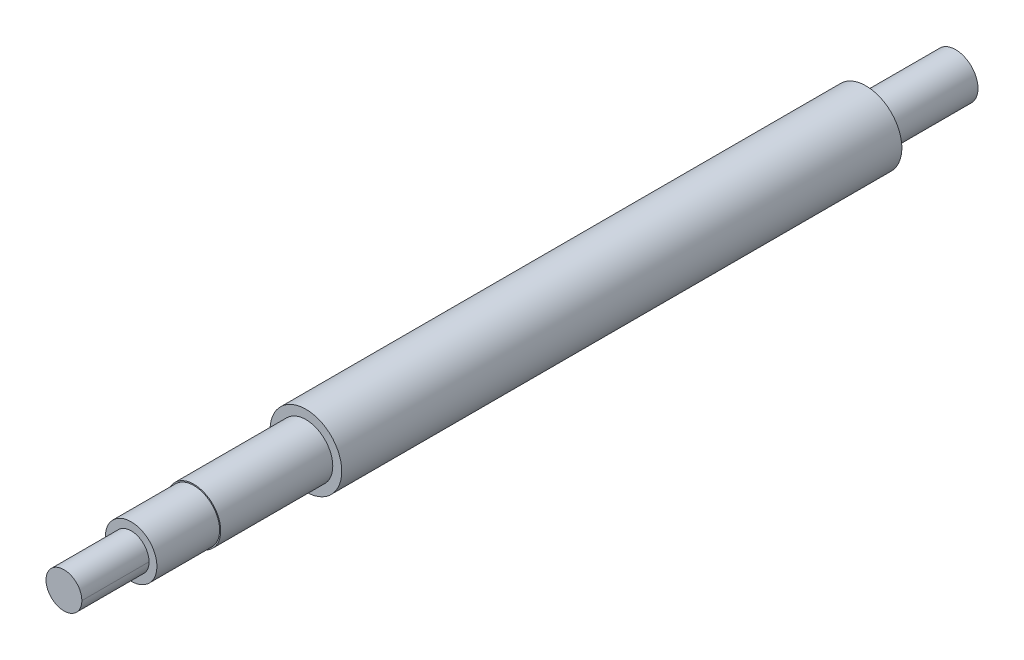
ISO-10303-21;
HEADER;
FILE_DESCRIPTION(('STEP AP214'),'2;1');
FILE_NAME('part.step','',(''),(''),'','','');
FILE_SCHEMA(('AUTOMOTIVE_DESIGN { 1 0 10303 214 1 1 1 1 }'));
ENDSEC;
DATA;
#1=APPLICATION_CONTEXT('core data for automotive mechanical design processes');
#2=APPLICATION_PROTOCOL_DEFINITION('international standard','automotive_design',2000,#1);
#3=PRODUCT_CONTEXT('',#1,'mechanical');
#4=PRODUCT('Part','Part','',(#3));
#5=PRODUCT_RELATED_PRODUCT_CATEGORY('part','',(#4));
#6=PRODUCT_DEFINITION_FORMATION('','',#4);
#7=PRODUCT_DEFINITION_CONTEXT('part definition',#1,'design');
#8=PRODUCT_DEFINITION('design','',#6,#7);
#9=PRODUCT_DEFINITION_SHAPE('','',#8);
#10=(LENGTH_UNIT() NAMED_UNIT(*) SI_UNIT(.MILLI.,.METRE.));
#11=(NAMED_UNIT(*) PLANE_ANGLE_UNIT() SI_UNIT($,.RADIAN.));
#12=(NAMED_UNIT(*) SI_UNIT($,.STERADIAN.) SOLID_ANGLE_UNIT());
#13=UNCERTAINTY_MEASURE_WITH_UNIT(LENGTH_MEASURE(1.E-05),#10,'distance_accuracy_value','');
#14=(GEOMETRIC_REPRESENTATION_CONTEXT(3) GLOBAL_UNCERTAINTY_ASSIGNED_CONTEXT((#13)) GLOBAL_UNIT_ASSIGNED_CONTEXT((#10,
#11,#12)) REPRESENTATION_CONTEXT('',''));
#15=CARTESIAN_POINT('',(0.,0.,0.));
#16=DIRECTION('',(0.,0.,1.));
#17=DIRECTION('',(1.,0.,0.));
#18=AXIS2_PLACEMENT_3D('',#15,#16,#17);
#19=CARTESIAN_POINT('',(0.,0.,145.));
#20=DIRECTION('',(0.,0.,-1.));
#21=DIRECTION('',(-1.,0.,0.));
#22=AXIS2_PLACEMENT_3D('',#19,#20,#21);
#23=CYLINDRICAL_SURFACE('',#22,8.);
#24=CARTESIAN_POINT('',(0.,0.,145.));
#25=DIRECTION('',(0.,0.,1.));
#26=DIRECTION('',(1.,0.,0.));
#27=AXIS2_PLACEMENT_3D('',#24,#25,#26);
#28=CIRCLE('',#27,8.);
#29=CARTESIAN_POINT('',(8.,0.,145.));
#30=VERTEX_POINT('',#29);
#31=EDGE_CURVE('E97',#30,#30,#28,.T.);
#32=ORIENTED_EDGE('',*,*,#31,.F.);
#33=EDGE_LOOP('',(#32));
#34=FACE_BOUND('',#33,.T.);
#35=CARTESIAN_POINT('',(0.,0.,20.));
#36=DIRECTION('',(0.,0.,-1.));
#37=DIRECTION('',(-1.,0.,0.));
#38=AXIS2_PLACEMENT_3D('',#35,#36,#37);
#39=CIRCLE('',#38,8.);
#40=CARTESIAN_POINT('',(-8.,0.,20.));
#41=VERTEX_POINT('',#40);
#42=EDGE_CURVE('E125',#41,#41,#39,.T.);
#43=ORIENTED_EDGE('',*,*,#42,.F.);
#44=EDGE_LOOP('',(#43));
#45=FACE_BOUND('',#44,.T.);
#46=ADVANCED_FACE('F46',(#34,#45),#23,.T.);
#47=CARTESIAN_POINT('',(0.,0.,199.));
#48=DIRECTION('',(0.,0.,-1.));
#49=DIRECTION('',(-1.,0.,0.));
#50=AXIS2_PLACEMENT_3D('',#47,#48,#49);
#51=CYLINDRICAL_SURFACE('',#50,4.);
#52=CARTESIAN_POINT('',(0.,0.,184.));
#53=DIRECTION('',(0.,0.,1.));
#54=DIRECTION('',(1.,0.,0.));
#55=AXIS2_PLACEMENT_3D('',#52,#53,#54);
#56=CIRCLE('',#55,4.);
#57=CARTESIAN_POINT('',(4.,0.,184.));
#58=VERTEX_POINT('',#57);
#59=CARTESIAN_POINT('',(-4.,0.,184.));
#60=VERTEX_POINT('',#59);
#61=EDGE_CURVE('E92',#58,#60,#56,.T.);
#62=ORIENTED_EDGE('',*,*,#61,.T.);
#63=DIRECTION('',(0.,0.,1.));
#64=VECTOR('',#63,1.);
#65=CARTESIAN_POINT('',(-4.,0.,199.));
#66=LINE('',#65,#64);
#67=CARTESIAN_POINT('',(-4.,0.,199.));
#68=VERTEX_POINT('',#67);
#69=EDGE_CURVE('E84',#60,#68,#66,.T.);
#70=ORIENTED_EDGE('',*,*,#69,.T.);
#71=CARTESIAN_POINT('',(0.,0.,199.));
#72=DIRECTION('',(0.,0.,1.));
#73=DIRECTION('',(1.,0.,0.));
#74=AXIS2_PLACEMENT_3D('',#71,#72,#73);
#75=CIRCLE('',#74,4.);
#76=CARTESIAN_POINT('',(4.,0.,199.));
#77=VERTEX_POINT('',#76);
#78=EDGE_CURVE('E117',#77,#68,#75,.T.);
#79=ORIENTED_EDGE('',*,*,#78,.F.);
#80=DIRECTION('',(0.,0.,-1.));
#81=VECTOR('',#80,1.);
#82=CARTESIAN_POINT('',(4.,0.,199.));
#83=LINE('',#82,#81);
#84=EDGE_CURVE('E86',#77,#58,#83,.T.);
#85=ORIENTED_EDGE('',*,*,#84,.T.);
#86=EDGE_LOOP('',(#62,#70,#79,#85));
#87=FACE_BOUND('',#86,.T.);
#88=ADVANCED_FACE('F143',(#87),#51,.T.);
#89=CARTESIAN_POINT('',(0.,0.,145.));
#90=DIRECTION('',(0.,0.,1.));
#91=DIRECTION('',(1.,0.,0.));
#92=AXIS2_PLACEMENT_3D('',#89,#90,#91);
#93=PLANE('',#92);
#94=CARTESIAN_POINT('',(0.,0.,145.));
#95=DIRECTION('',(0.,0.,1.));
#96=DIRECTION('',(1.,0.,0.));
#97=AXIS2_PLACEMENT_3D('',#94,#95,#96);
#98=CIRCLE('',#97,6.);
#99=CARTESIAN_POINT('',(6.,0.,145.));
#100=VERTEX_POINT('',#99);
#101=EDGE_CURVE('E96',#100,#100,#98,.T.);
#102=ORIENTED_EDGE('',*,*,#101,.F.);
#103=EDGE_LOOP('',(#102));
#104=FACE_BOUND('',#103,.T.);
#105=ORIENTED_EDGE('',*,*,#31,.T.);
#106=EDGE_LOOP('',(#105));
#107=FACE_BOUND('',#106,.T.);
#108=ADVANCED_FACE('F149',(#104,#107),#93,.T.);
#109=CARTESIAN_POINT('',(0.,0.,170.));
#110=DIRECTION('',(0.,0.,-1.));
#111=DIRECTION('',(-1.,0.,0.));
#112=AXIS2_PLACEMENT_3D('',#109,#110,#111);
#113=CYLINDRICAL_SURFACE('',#112,6.);
#114=CARTESIAN_POINT('',(0.,0.,170.));
#115=DIRECTION('',(0.,0.,1.));
#116=DIRECTION('',(1.,0.,0.));
#117=AXIS2_PLACEMENT_3D('',#114,#115,#116);
#118=CIRCLE('',#117,6.);
#119=CARTESIAN_POINT('',(6.,0.,170.));
#120=VERTEX_POINT('',#119);
#121=EDGE_CURVE('E101',#120,#120,#118,.T.);
#122=ORIENTED_EDGE('',*,*,#121,.F.);
#123=EDGE_LOOP('',(#122));
#124=FACE_BOUND('',#123,.T.);
#125=ORIENTED_EDGE('',*,*,#101,.T.);
#126=EDGE_LOOP('',(#125));
#127=FACE_BOUND('',#126,.T.);
#128=ADVANCED_FACE('F187',(#124,#127),#113,.T.);
#129=CARTESIAN_POINT('',(0.,0.,170.));
#130=DIRECTION('',(0.,0.,1.));
#131=DIRECTION('',(1.,0.,0.));
#132=AXIS2_PLACEMENT_3D('',#129,#130,#131);
#133=PLANE('',#132);
#134=CARTESIAN_POINT('',(0.,0.,170.));
#135=DIRECTION('',(0.,0.,1.));
#136=DIRECTION('',(1.,0.,0.));
#137=AXIS2_PLACEMENT_3D('',#134,#135,#136);
#138=CIRCLE('',#137,5.75);
#139=CARTESIAN_POINT('',(5.75,0.,170.));
#140=VERTEX_POINT('',#139);
#141=EDGE_CURVE('E105',#140,#140,#138,.T.);
#142=ORIENTED_EDGE('',*,*,#141,.F.);
#143=EDGE_LOOP('',(#142));
#144=FACE_BOUND('',#143,.T.);
#145=ORIENTED_EDGE('',*,*,#121,.T.);
#146=EDGE_LOOP('',(#145));
#147=FACE_BOUND('',#146,.T.);
#148=ADVANCED_FACE('F181',(#144,#147),#133,.T.);
#149=CARTESIAN_POINT('',(0.,0.,184.));
#150=DIRECTION('',(0.,0.,-1.));
#151=DIRECTION('',(-1.,0.,0.));
#152=AXIS2_PLACEMENT_3D('',#149,#150,#151);
#153=CYLINDRICAL_SURFACE('',#152,5.75);
#154=CARTESIAN_POINT('',(0.,0.,184.));
#155=DIRECTION('',(0.,0.,1.));
#156=DIRECTION('',(1.,0.,0.));
#157=AXIS2_PLACEMENT_3D('',#154,#155,#156);
#158=CIRCLE('',#157,5.75);
#159=CARTESIAN_POINT('',(5.75,0.,184.));
#160=VERTEX_POINT('',#159);
#161=EDGE_CURVE('E109',#160,#160,#158,.T.);
#162=ORIENTED_EDGE('',*,*,#161,.F.);
#163=EDGE_LOOP('',(#162));
#164=FACE_BOUND('',#163,.T.);
#165=ORIENTED_EDGE('',*,*,#141,.T.);
#166=EDGE_LOOP('',(#165));
#167=FACE_BOUND('',#166,.T.);
#168=ADVANCED_FACE('F175',(#164,#167),#153,.T.);
#169=CARTESIAN_POINT('',(0.,0.,184.));
#170=DIRECTION('',(0.,0.,1.));
#171=DIRECTION('',(1.,0.,0.));
#172=AXIS2_PLACEMENT_3D('',#169,#170,#171);
#173=PLANE('',#172);
#174=ORIENTED_EDGE('',*,*,#61,.F.);
#175=EDGE_CURVE('E113',#60,#58,#56,.T.);
#176=ORIENTED_EDGE('',*,*,#175,.F.);
#177=EDGE_LOOP('',(#174,#176));
#178=FACE_BOUND('',#177,.T.);
#179=ORIENTED_EDGE('',*,*,#161,.T.);
#180=EDGE_LOOP('',(#179));
#181=FACE_BOUND('',#180,.T.);
#182=ADVANCED_FACE('F171',(#178,#181),#173,.T.);
#183=ORIENTED_EDGE('',*,*,#69,.F.);
#184=ORIENTED_EDGE('',*,*,#175,.T.);
#185=ORIENTED_EDGE('',*,*,#84,.F.);
#186=EDGE_CURVE('E124',#68,#77,#75,.T.);
#187=ORIENTED_EDGE('',*,*,#186,.F.);
#188=EDGE_LOOP('',(#183,#184,#185,#187));
#189=FACE_BOUND('',#188,.T.);
#190=ADVANCED_FACE('F152',(#189),#51,.T.);
#191=CARTESIAN_POINT('',(0.,0.,199.));
#192=DIRECTION('',(0.,0.,1.));
#193=DIRECTION('',(1.,0.,0.));
#194=AXIS2_PLACEMENT_3D('',#191,#192,#193);
#195=PLANE('',#194);
#196=ORIENTED_EDGE('',*,*,#78,.T.);
#197=ORIENTED_EDGE('',*,*,#186,.T.);
#198=EDGE_LOOP('',(#196,#197));
#199=FACE_BOUND('',#198,.T.);
#200=ADVANCED_FACE('F138',(#199),#195,.T.);
#201=CARTESIAN_POINT('',(0.,0.,20.));
#202=DIRECTION('',(0.,0.,-1.));
#203=DIRECTION('',(-1.,0.,0.));
#204=AXIS2_PLACEMENT_3D('',#201,#202,#203);
#205=PLANE('',#204);
#206=CARTESIAN_POINT('',(0.,0.,20.));
#207=DIRECTION('',(0.,0.,-1.));
#208=DIRECTION('',(-1.,0.,0.));
#209=AXIS2_PLACEMENT_3D('',#206,#207,#208);
#210=CIRCLE('',#209,5.);
#211=CARTESIAN_POINT('',(-5.,0.,20.));
#212=VERTEX_POINT('',#211);
#213=EDGE_CURVE('E129',#212,#212,#210,.T.);
#214=ORIENTED_EDGE('',*,*,#213,.F.);
#215=EDGE_LOOP('',(#214));
#216=FACE_BOUND('',#215,.T.);
#217=ORIENTED_EDGE('',*,*,#42,.T.);
#218=EDGE_LOOP('',(#217));
#219=FACE_BOUND('',#218,.T.);
#220=ADVANCED_FACE('F134',(#216,#219),#205,.T.);
#221=CARTESIAN_POINT('',(0.,0.,0.));
#222=DIRECTION('',(0.,0.,1.));
#223=DIRECTION('',(1.,0.,0.));
#224=AXIS2_PLACEMENT_3D('',#221,#222,#223);
#225=PLANE('',#224);
#226=CARTESIAN_POINT('',(0.,0.,0.));
#227=DIRECTION('',(0.,0.,1.));
#228=DIRECTION('',(1.,0.,0.));
#229=AXIS2_PLACEMENT_3D('',#226,#227,#228);
#230=CIRCLE('',#229,5.);
#231=CARTESIAN_POINT('',(5.,0.,0.));
#232=VERTEX_POINT('',#231);
#233=CARTESIAN_POINT('',(-5.,0.,0.));
#234=VERTEX_POINT('',#233);
#235=EDGE_CURVE('E93',#232,#234,#230,.T.);
#236=ORIENTED_EDGE('',*,*,#235,.F.);
#237=EDGE_CURVE('E82',#234,#232,#230,.T.);
#238=ORIENTED_EDGE('',*,*,#237,.F.);
#239=EDGE_LOOP('',(#236,#238));
#240=FACE_BOUND('',#239,.T.);
#241=ADVANCED_FACE('F137',(#240),#225,.F.);
#242=CARTESIAN_POINT('',(0.,0.,10.));
#243=DIRECTION('',(0.,0.,-1.));
#244=DIRECTION('',(-1.,0.,0.));
#245=AXIS2_PLACEMENT_3D('',#242,#243,#244);
#246=CYLINDRICAL_SURFACE('',#245,5.);
#247=DIRECTION('',(0.,0.,1.));
#248=VECTOR('',#247,1.);
#249=CARTESIAN_POINT('',(-5.,0.,10.));
#250=LINE('',#249,#248);
#251=CARTESIAN_POINT('',(-5.,0.,10.));
#252=VERTEX_POINT('',#251);
#253=EDGE_CURVE('E12',#234,#252,#250,.T.);
#254=ORIENTED_EDGE('',*,*,#253,.F.);
#255=ORIENTED_EDGE('',*,*,#237,.T.);
#256=DIRECTION('',(0.,0.,-1.));
#257=VECTOR('',#256,1.);
#258=CARTESIAN_POINT('',(5.,0.,10.));
#259=LINE('',#258,#257);
#260=CARTESIAN_POINT('',(5.,0.,10.));
#261=VERTEX_POINT('',#260);
#262=EDGE_CURVE('E55',#261,#232,#259,.T.);
#263=ORIENTED_EDGE('',*,*,#262,.F.);
#264=ORIENTED_EDGE('',*,*,#262,.T.);
#265=ORIENTED_EDGE('',*,*,#235,.T.);
#266=ORIENTED_EDGE('',*,*,#253,.T.);
#267=EDGE_LOOP('',(#254,#255,#263,#264,#265,#266));
#268=FACE_BOUND('',#267,.T.);
#269=ORIENTED_EDGE('',*,*,#213,.T.);
#270=EDGE_LOOP('',(#269));
#271=FACE_BOUND('',#270,.T.);
#272=ADVANCED_FACE('F48',(#268,#271),#246,.T.);
#273=CLOSED_SHELL('',(#46,#88,#108,#128,#148,#168,#182,#190,#200,#220,#241,#272));
#274=MANIFOLD_SOLID_BREP('B2',#273);
#275=ADVANCED_BREP_SHAPE_REPRESENTATION('',(#18,#274),#14);
#276=SHAPE_DEFINITION_REPRESENTATION(#9,#275);
ENDSEC;
END-ISO-10303-21;
